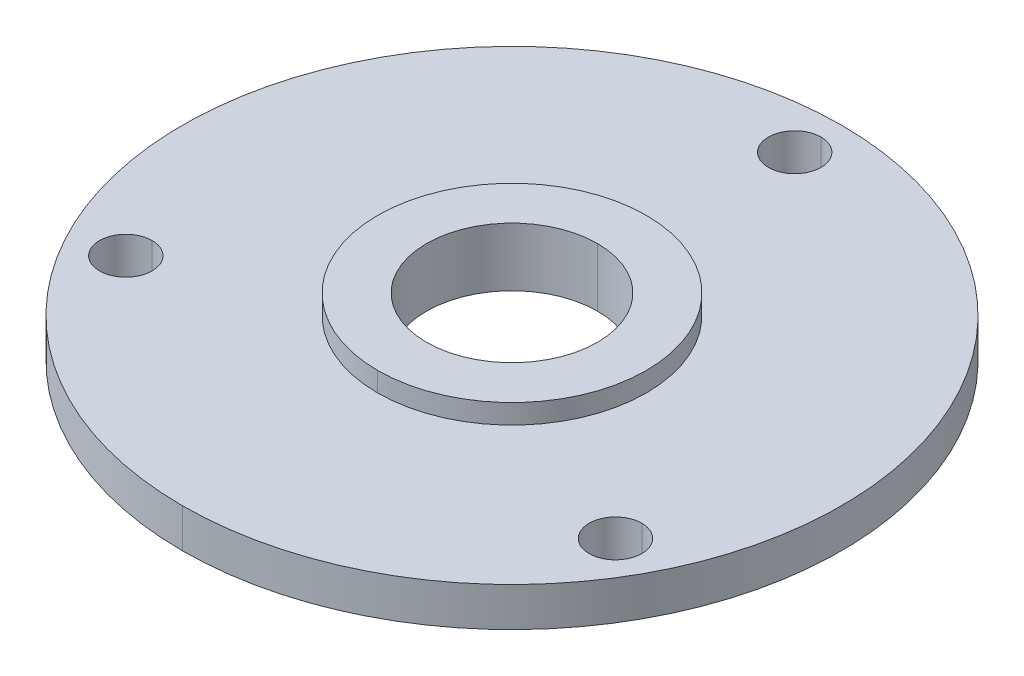
ISO-10303-21;
HEADER;
FILE_DESCRIPTION(('STEP AP214'),'2;1');
FILE_NAME('part.step','',(''),(''),'','','');
FILE_SCHEMA(('AUTOMOTIVE_DESIGN { 1 0 10303 214 1 1 1 1 }'));
ENDSEC;
DATA;
#1=APPLICATION_CONTEXT('core data for automotive mechanical design processes');
#2=APPLICATION_PROTOCOL_DEFINITION('international standard','automotive_design',2000,#1);
#3=PRODUCT_CONTEXT('',#1,'mechanical');
#4=PRODUCT('Part','Part','',(#3));
#5=PRODUCT_RELATED_PRODUCT_CATEGORY('part','',(#4));
#6=PRODUCT_DEFINITION_FORMATION('','',#4);
#7=PRODUCT_DEFINITION_CONTEXT('part definition',#1,'design');
#8=PRODUCT_DEFINITION('design','',#6,#7);
#9=PRODUCT_DEFINITION_SHAPE('','',#8);
#10=(LENGTH_UNIT() NAMED_UNIT(*) SI_UNIT(.MILLI.,.METRE.));
#11=(NAMED_UNIT(*) PLANE_ANGLE_UNIT() SI_UNIT($,.RADIAN.));
#12=(NAMED_UNIT(*) SI_UNIT($,.STERADIAN.) SOLID_ANGLE_UNIT());
#13=UNCERTAINTY_MEASURE_WITH_UNIT(LENGTH_MEASURE(1.E-05),#10,'distance_accuracy_value','');
#14=(GEOMETRIC_REPRESENTATION_CONTEXT(3) GLOBAL_UNCERTAINTY_ASSIGNED_CONTEXT((#13)) GLOBAL_UNIT_ASSIGNED_CONTEXT((#10,
#11,#12)) REPRESENTATION_CONTEXT('',''));
#15=CARTESIAN_POINT('',(0.,0.,0.));
#16=DIRECTION('',(0.,0.,1.));
#17=DIRECTION('',(1.,0.,0.));
#18=AXIS2_PLACEMENT_3D('',#15,#16,#17);
#19=CARTESIAN_POINT('',(1.2715687545039E-12,0.,-18.3893262792378));
#20=DIRECTION('',(0.,1.,0.));
#21=DIRECTION('',(0.,0.,1.));
#22=AXIS2_PLACEMENT_3D('',#19,#20,#21);
#23=CYLINDRICAL_SURFACE('',#22,1.71138923587516);
#24=DIRECTION('',(0.,1.,0.));
#25=VECTOR('',#24,1.);
#26=CARTESIAN_POINT('',(1.27177833923888E-12,0.,-20.100715515113));
#27=LINE('',#26,#25);
#28=CARTESIAN_POINT('',(1.27177833923888E-12,0.,-20.100715515113));
#29=VERTEX_POINT('',#28);
#30=CARTESIAN_POINT('',(1.27177833923888E-12,2.54,-20.100715515113));
#31=VERTEX_POINT('',#30);
#32=EDGE_CURVE('E163',#29,#31,#27,.T.);
#33=ORIENTED_EDGE('',*,*,#32,.F.);
#34=CARTESIAN_POINT('',(1.2715687545039E-12,0.,-18.3893262792378));
#35=DIRECTION('',(0.,1.,0.));
#36=DIRECTION('',(0.,0.,1.));
#37=AXIS2_PLACEMENT_3D('',#34,#35,#36);
#38=CIRCLE('',#37,1.71138923587516);
#39=CARTESIAN_POINT('',(1.2715687545039E-12,0.,-16.6779370433627));
#40=VERTEX_POINT('',#39);
#41=EDGE_CURVE('E198',#40,#29,#38,.T.);
#42=ORIENTED_EDGE('',*,*,#41,.F.);
#43=DIRECTION('',(0.,1.,0.));
#44=VECTOR('',#43,1.);
#45=CARTESIAN_POINT('',(1.2715687545039E-12,0.,-16.6779370433627));
#46=LINE('',#45,#44);
#47=CARTESIAN_POINT('',(1.2715687545039E-12,2.54,-16.6779370433627));
#48=VERTEX_POINT('',#47);
#49=EDGE_CURVE('E166',#40,#48,#46,.T.);
#50=ORIENTED_EDGE('',*,*,#49,.T.);
#51=CARTESIAN_POINT('',(1.2715687545039E-12,2.54,-18.3893262792378));
#52=DIRECTION('',(0.,1.,0.));
#53=DIRECTION('',(0.,0.,1.));
#54=AXIS2_PLACEMENT_3D('',#51,#52,#53);
#55=CIRCLE('',#54,1.71138923587516);
#56=EDGE_CURVE('E155',#48,#31,#55,.T.);
#57=ORIENTED_EDGE('',*,*,#56,.T.);
#58=EDGE_LOOP('',(#33,#42,#50,#57));
#59=FACE_BOUND('',#58,.T.);
#60=ADVANCED_FACE('F16',(#59),#23,.F.);
#61=CARTESIAN_POINT('',(15.9256237163013,0.,9.19466313961934));
#62=DIRECTION('',(0.,1.,0.));
#63=DIRECTION('',(0.,0.,1.));
#64=AXIS2_PLACEMENT_3D('',#61,#62,#63);
#65=CYLINDRICAL_SURFACE('',#64,1.71138923587618);
#66=DIRECTION('',(0.,1.,0.));
#67=VECTOR('',#66,1.);
#68=CARTESIAN_POINT('',(15.9256237163013,0.,7.48327390374317));
#69=LINE('',#68,#67);
#70=CARTESIAN_POINT('',(15.9256237163013,0.,7.48327390374317));
#71=VERTEX_POINT('',#70);
#72=CARTESIAN_POINT('',(15.9256237163013,2.54,7.48327390374317));
#73=VERTEX_POINT('',#72);
#74=EDGE_CURVE('E205',#71,#73,#69,.T.);
#75=ORIENTED_EDGE('',*,*,#74,.F.);
#76=CARTESIAN_POINT('',(15.9256237163013,0.,9.19466313961934));
#77=DIRECTION('',(0.,1.,0.));
#78=DIRECTION('',(0.,0.,1.));
#79=AXIS2_PLACEMENT_3D('',#76,#77,#78);
#80=CIRCLE('',#79,1.71138923587618);
#81=CARTESIAN_POINT('',(15.9256237163013,0.,10.9060523754955));
#82=VERTEX_POINT('',#81);
#83=EDGE_CURVE('E148',#82,#71,#80,.T.);
#84=ORIENTED_EDGE('',*,*,#83,.F.);
#85=DIRECTION('',(0.,1.,0.));
#86=VECTOR('',#85,1.);
#87=CARTESIAN_POINT('',(15.9256237163013,0.,10.9060523754955));
#88=LINE('',#87,#86);
#89=CARTESIAN_POINT('',(15.9256237163013,2.54,10.9060523754955));
#90=VERTEX_POINT('',#89);
#91=EDGE_CURVE('E204',#82,#90,#88,.T.);
#92=ORIENTED_EDGE('',*,*,#91,.T.);
#93=CARTESIAN_POINT('',(15.9256237163013,2.54,9.19466313961934));
#94=DIRECTION('',(0.,1.,0.));
#95=DIRECTION('',(0.,0.,1.));
#96=AXIS2_PLACEMENT_3D('',#93,#94,#95);
#97=CIRCLE('',#96,1.71138923587618);
#98=EDGE_CURVE('E123',#90,#73,#97,.T.);
#99=ORIENTED_EDGE('',*,*,#98,.T.);
#100=EDGE_LOOP('',(#75,#84,#92,#99));
#101=FACE_BOUND('',#100,.T.);
#102=ADVANCED_FACE('F521',(#101),#65,.F.);
#103=CARTESIAN_POINT('',(-15.9256237163002,0.,9.19466313961852));
#104=DIRECTION('',(0.,1.,0.));
#105=DIRECTION('',(0.,0.,1.));
#106=AXIS2_PLACEMENT_3D('',#103,#104,#105);
#107=CYLINDRICAL_SURFACE('',#106,1.71138923587664);
#108=DIRECTION('',(0.,1.,0.));
#109=VECTOR('',#108,1.);
#110=CARTESIAN_POINT('',(-15.9256237163002,0.,7.48327390374187));
#111=LINE('',#110,#109);
#112=CARTESIAN_POINT('',(-15.9256237163002,0.,7.48327390374187));
#113=VERTEX_POINT('',#112);
#114=CARTESIAN_POINT('',(-15.9256237163002,2.54,7.48327390374187));
#115=VERTEX_POINT('',#114);
#116=EDGE_CURVE('E194',#113,#115,#111,.T.);
#117=ORIENTED_EDGE('',*,*,#116,.F.);
#118=CARTESIAN_POINT('',(-15.9256237163002,0.,9.19466313961852));
#119=DIRECTION('',(0.,1.,0.));
#120=DIRECTION('',(0.,0.,1.));
#121=AXIS2_PLACEMENT_3D('',#118,#119,#120);
#122=CIRCLE('',#121,1.71138923587664);
#123=CARTESIAN_POINT('',(-15.9256237163002,0.,10.9060523754952));
#124=VERTEX_POINT('',#123);
#125=EDGE_CURVE('E229',#124,#113,#122,.T.);
#126=ORIENTED_EDGE('',*,*,#125,.F.);
#127=DIRECTION('',(0.,1.,0.));
#128=VECTOR('',#127,1.);
#129=CARTESIAN_POINT('',(-15.9256237163002,0.,10.9060523754952));
#130=LINE('',#129,#128);
#131=CARTESIAN_POINT('',(-15.9256237163002,2.54,10.9060523754952));
#132=VERTEX_POINT('',#131);
#133=EDGE_CURVE('E193',#124,#132,#130,.T.);
#134=ORIENTED_EDGE('',*,*,#133,.T.);
#135=CARTESIAN_POINT('',(-15.9256237163002,2.54,9.19466313961852));
#136=DIRECTION('',(0.,1.,0.));
#137=DIRECTION('',(0.,0.,1.));
#138=AXIS2_PLACEMENT_3D('',#135,#136,#137);
#139=CIRCLE('',#138,1.71138923587664);
#140=EDGE_CURVE('E114',#132,#115,#139,.T.);
#141=ORIENTED_EDGE('',*,*,#140,.T.);
#142=EDGE_LOOP('',(#117,#126,#134,#141));
#143=FACE_BOUND('',#142,.T.);
#144=ADVANCED_FACE('F442',(#143),#107,.F.);
#145=CARTESIAN_POINT('',(0.,0.,0.));
#146=DIRECTION('',(0.,1.,0.));
#147=DIRECTION('',(0.,0.,1.));
#148=AXIS2_PLACEMENT_3D('',#145,#146,#147);
#149=CYLINDRICAL_SURFACE('',#148,5.5626);
#150=DIRECTION('',(0.,1.,0.));
#151=VECTOR('',#150,1.);
#152=CARTESIAN_POINT('',(0.,0.,-5.5626));
#153=LINE('',#152,#151);
#154=CARTESIAN_POINT('',(0.,0.,-5.5626));
#155=VERTEX_POINT('',#154);
#156=CARTESIAN_POINT('',(0.,3.81,-5.5626));
#157=VERTEX_POINT('',#156);
#158=EDGE_CURVE('E238',#155,#157,#153,.T.);
#159=ORIENTED_EDGE('',*,*,#158,.F.);
#160=CARTESIAN_POINT('',(0.,0.,0.));
#161=DIRECTION('',(0.,1.,0.));
#162=DIRECTION('',(0.,0.,1.));
#163=AXIS2_PLACEMENT_3D('',#160,#161,#162);
#164=CIRCLE('',#163,5.5626);
#165=CARTESIAN_POINT('',(0.,0.,5.5626));
#166=VERTEX_POINT('',#165);
#167=EDGE_CURVE('E102',#166,#155,#164,.T.);
#168=ORIENTED_EDGE('',*,*,#167,.F.);
#169=DIRECTION('',(0.,1.,0.));
#170=VECTOR('',#169,1.);
#171=CARTESIAN_POINT('',(0.,0.,5.5626));
#172=LINE('',#171,#170);
#173=CARTESIAN_POINT('',(0.,3.81,5.5626));
#174=VERTEX_POINT('',#173);
#175=EDGE_CURVE('E232',#166,#174,#172,.T.);
#176=ORIENTED_EDGE('',*,*,#175,.T.);
#177=CARTESIAN_POINT('',(0.,3.81,0.));
#178=DIRECTION('',(0.,1.,0.));
#179=DIRECTION('',(0.,0.,1.));
#180=AXIS2_PLACEMENT_3D('',#177,#178,#179);
#181=CIRCLE('',#180,5.5626);
#182=EDGE_CURVE('E11',#174,#157,#181,.T.);
#183=ORIENTED_EDGE('',*,*,#182,.T.);
#184=EDGE_LOOP('',(#159,#168,#176,#183));
#185=FACE_BOUND('',#184,.T.);
#186=ADVANCED_FACE('F437',(#185),#149,.F.);
#187=CARTESIAN_POINT('',(0.,3.81,0.));
#188=DIRECTION('',(0.,1.,0.));
#189=DIRECTION('',(1.,0.,0.));
#190=AXIS2_PLACEMENT_3D('',#187,#188,#189);
#191=PLANE('',#190);
#192=ORIENTED_EDGE('',*,*,#182,.F.);
#193=CARTESIAN_POINT('',(0.,3.81,0.));
#194=DIRECTION('',(0.,1.,0.));
#195=DIRECTION('',(0.,0.,1.));
#196=AXIS2_PLACEMENT_3D('',#193,#194,#195);
#197=CIRCLE('',#196,5.5626);
#198=EDGE_CURVE('E237',#157,#174,#197,.T.);
#199=ORIENTED_EDGE('',*,*,#198,.F.);
#200=EDGE_LOOP('',(#192,#199));
#201=FACE_BOUND('',#200,.T.);
#202=CARTESIAN_POINT('',(0.,3.81,0.));
#203=DIRECTION('',(0.,1.,0.));
#204=DIRECTION('',(0.,0.,1.));
#205=AXIS2_PLACEMENT_3D('',#202,#203,#204);
#206=CIRCLE('',#205,8.7376);
#207=CARTESIAN_POINT('',(0.,3.81,-8.7376));
#208=VERTEX_POINT('',#207);
#209=CARTESIAN_POINT('',(0.,3.81,8.7376));
#210=VERTEX_POINT('',#209);
#211=EDGE_CURVE('E27',#208,#210,#206,.T.);
#212=ORIENTED_EDGE('',*,*,#211,.T.);
#213=CARTESIAN_POINT('',(0.,3.81,0.));
#214=DIRECTION('',(0.,1.,0.));
#215=DIRECTION('',(0.,0.,1.));
#216=AXIS2_PLACEMENT_3D('',#213,#214,#215);
#217=CIRCLE('',#216,8.7376);
#218=EDGE_CURVE('E236',#210,#208,#217,.T.);
#219=ORIENTED_EDGE('',*,*,#218,.T.);
#220=EDGE_LOOP('',(#212,#219));
#221=FACE_BOUND('',#220,.T.);
#222=ADVANCED_FACE('F441',(#201,#221),#191,.T.);
#223=CARTESIAN_POINT('',(0.,3.81,0.));
#224=DIRECTION('',(0.,-1.,0.));
#225=DIRECTION('',(0.,0.,-1.));
#226=AXIS2_PLACEMENT_3D('',#223,#224,#225);
#227=CYLINDRICAL_SURFACE('',#226,8.7376);
#228=DIRECTION('',(0.,-1.,0.));
#229=VECTOR('',#228,1.);
#230=CARTESIAN_POINT('',(0.,3.81,8.7376));
#231=LINE('',#230,#229);
#232=CARTESIAN_POINT('',(0.,2.54,8.7376));
#233=VERTEX_POINT('',#232);
#234=EDGE_CURVE('E218',#210,#233,#231,.T.);
#235=ORIENTED_EDGE('',*,*,#234,.F.);
#236=ORIENTED_EDGE('',*,*,#211,.F.);
#237=DIRECTION('',(0.,-1.,0.));
#238=VECTOR('',#237,1.);
#239=CARTESIAN_POINT('',(0.,3.81,-8.7376));
#240=LINE('',#239,#238);
#241=CARTESIAN_POINT('',(0.,2.54,-8.7376));
#242=VERTEX_POINT('',#241);
#243=EDGE_CURVE('E217',#208,#242,#240,.T.);
#244=ORIENTED_EDGE('',*,*,#243,.T.);
#245=CARTESIAN_POINT('',(0.,2.54,0.));
#246=DIRECTION('',(0.,1.,0.));
#247=DIRECTION('',(0.,0.,1.));
#248=AXIS2_PLACEMENT_3D('',#245,#246,#247);
#249=CIRCLE('',#248,8.7376);
#250=EDGE_CURVE('E195',#242,#233,#249,.T.);
#251=ORIENTED_EDGE('',*,*,#250,.T.);
#252=EDGE_LOOP('',(#235,#236,#244,#251));
#253=FACE_BOUND('',#252,.T.);
#254=ADVANCED_FACE('F460',(#253),#227,.T.);
#255=CARTESIAN_POINT('',(0.,0.,0.));
#256=DIRECTION('',(0.,1.,0.));
#257=DIRECTION('',(1.,0.,0.));
#258=AXIS2_PLACEMENT_3D('',#255,#256,#257);
#259=PLANE('',#258);
#260=ORIENTED_EDGE('',*,*,#167,.T.);
#261=CARTESIAN_POINT('',(0.,0.,0.));
#262=DIRECTION('',(0.,1.,0.));
#263=DIRECTION('',(0.,0.,1.));
#264=AXIS2_PLACEMENT_3D('',#261,#262,#263);
#265=CIRCLE('',#264,5.5626);
#266=EDGE_CURVE('E221',#155,#166,#265,.T.);
#267=ORIENTED_EDGE('',*,*,#266,.T.);
#268=EDGE_LOOP('',(#260,#267));
#269=FACE_BOUND('',#268,.T.);
#270=ORIENTED_EDGE('',*,*,#125,.T.);
#271=CARTESIAN_POINT('',(-15.9256237163002,0.,9.19466313961852));
#272=DIRECTION('',(0.,1.,0.));
#273=DIRECTION('',(0.,0.,1.));
#274=AXIS2_PLACEMENT_3D('',#271,#272,#273);
#275=CIRCLE('',#274,1.71138923587664);
#276=EDGE_CURVE('E212',#113,#124,#275,.T.);
#277=ORIENTED_EDGE('',*,*,#276,.T.);
#278=EDGE_LOOP('',(#270,#277));
#279=FACE_BOUND('',#278,.T.);
#280=ORIENTED_EDGE('',*,*,#83,.T.);
#281=CARTESIAN_POINT('',(15.9256237163013,0.,9.19466313961934));
#282=DIRECTION('',(0.,1.,0.));
#283=DIRECTION('',(0.,0.,1.));
#284=AXIS2_PLACEMENT_3D('',#281,#282,#283);
#285=CIRCLE('',#284,1.71138923587618);
#286=EDGE_CURVE('E252',#71,#82,#285,.T.);
#287=ORIENTED_EDGE('',*,*,#286,.T.);
#288=EDGE_LOOP('',(#280,#287));
#289=FACE_BOUND('',#288,.T.);
#290=ORIENTED_EDGE('',*,*,#41,.T.);
#291=CARTESIAN_POINT('',(1.2715687545039E-12,0.,-18.3893262792378));
#292=DIRECTION('',(0.,1.,0.));
#293=DIRECTION('',(0.,0.,1.));
#294=AXIS2_PLACEMENT_3D('',#291,#292,#293);
#295=CIRCLE('',#294,1.71138923587516);
#296=EDGE_CURVE('E178',#29,#40,#295,.T.);
#297=ORIENTED_EDGE('',*,*,#296,.T.);
#298=EDGE_LOOP('',(#290,#297));
#299=FACE_BOUND('',#298,.T.);
#300=CARTESIAN_POINT('',(0.,0.,0.));
#301=DIRECTION('',(0.,1.,0.));
#302=DIRECTION('',(0.,0.,1.));
#303=AXIS2_PLACEMENT_3D('',#300,#301,#302);
#304=CIRCLE('',#303,21.4376);
#305=CARTESIAN_POINT('',(0.,0.,-21.4376));
#306=VERTEX_POINT('',#305);
#307=CARTESIAN_POINT('',(0.,0.,21.4376));
#308=VERTEX_POINT('',#307);
#309=EDGE_CURVE('E41',#306,#308,#304,.T.);
#310=ORIENTED_EDGE('',*,*,#309,.F.);
#311=CARTESIAN_POINT('',(0.,0.,0.));
#312=DIRECTION('',(0.,1.,0.));
#313=DIRECTION('',(0.,0.,1.));
#314=AXIS2_PLACEMENT_3D('',#311,#312,#313);
#315=CIRCLE('',#314,21.4376);
#316=EDGE_CURVE('E20',#308,#306,#315,.T.);
#317=ORIENTED_EDGE('',*,*,#316,.F.);
#318=EDGE_LOOP('',(#310,#317));
#319=FACE_BOUND('',#318,.T.);
#320=ADVANCED_FACE('F483',(#269,#279,#289,#299,#319),#259,.F.);
#321=CARTESIAN_POINT('',(0.,2.54,0.));
#322=DIRECTION('',(0.,1.,0.));
#323=DIRECTION('',(1.,0.,0.));
#324=AXIS2_PLACEMENT_3D('',#321,#322,#323);
#325=PLANE('',#324);
#326=ORIENTED_EDGE('',*,*,#250,.F.);
#327=CARTESIAN_POINT('',(0.,2.54,0.));
#328=DIRECTION('',(0.,1.,0.));
#329=DIRECTION('',(0.,0.,1.));
#330=AXIS2_PLACEMENT_3D('',#327,#328,#329);
#331=CIRCLE('',#330,8.7376);
#332=EDGE_CURVE('E213',#233,#242,#331,.T.);
#333=ORIENTED_EDGE('',*,*,#332,.F.);
#334=EDGE_LOOP('',(#326,#333));
#335=FACE_BOUND('',#334,.T.);
#336=ORIENTED_EDGE('',*,*,#140,.F.);
#337=CARTESIAN_POINT('',(-15.9256237163002,2.54,9.19466313961852));
#338=DIRECTION('',(0.,1.,0.));
#339=DIRECTION('',(0.,0.,1.));
#340=AXIS2_PLACEMENT_3D('',#337,#338,#339);
#341=CIRCLE('',#340,1.71138923587664);
#342=EDGE_CURVE('E189',#115,#132,#341,.T.);
#343=ORIENTED_EDGE('',*,*,#342,.F.);
#344=EDGE_LOOP('',(#336,#343));
#345=FACE_BOUND('',#344,.T.);
#346=ORIENTED_EDGE('',*,*,#98,.F.);
#347=CARTESIAN_POINT('',(15.9256237163013,2.54,9.19466313961934));
#348=DIRECTION('',(0.,1.,0.));
#349=DIRECTION('',(0.,0.,1.));
#350=AXIS2_PLACEMENT_3D('',#347,#348,#349);
#351=CIRCLE('',#350,1.71138923587618);
#352=EDGE_CURVE('E201',#73,#90,#351,.T.);
#353=ORIENTED_EDGE('',*,*,#352,.F.);
#354=EDGE_LOOP('',(#346,#353));
#355=FACE_BOUND('',#354,.T.);
#356=ORIENTED_EDGE('',*,*,#56,.F.);
#357=CARTESIAN_POINT('',(1.2715687545039E-12,2.54,-18.3893262792378));
#358=DIRECTION('',(0.,1.,0.));
#359=DIRECTION('',(0.,0.,1.));
#360=AXIS2_PLACEMENT_3D('',#357,#358,#359);
#361=CIRCLE('',#360,1.71138923587516);
#362=EDGE_CURVE('E170',#31,#48,#361,.T.);
#363=ORIENTED_EDGE('',*,*,#362,.F.);
#364=EDGE_LOOP('',(#356,#363));
#365=FACE_BOUND('',#364,.T.);
#366=CARTESIAN_POINT('',(0.,2.54,0.));
#367=DIRECTION('',(0.,1.,0.));
#368=DIRECTION('',(0.,0.,1.));
#369=AXIS2_PLACEMENT_3D('',#366,#367,#368);
#370=CIRCLE('',#369,21.4376);
#371=CARTESIAN_POINT('',(0.,2.54,-21.4376));
#372=VERTEX_POINT('',#371);
#373=CARTESIAN_POINT('',(0.,2.54,21.4376));
#374=VERTEX_POINT('',#373);
#375=EDGE_CURVE('E248',#372,#374,#370,.T.);
#376=ORIENTED_EDGE('',*,*,#375,.T.);
#377=CARTESIAN_POINT('',(0.,2.54,0.));
#378=DIRECTION('',(0.,1.,0.));
#379=DIRECTION('',(0.,0.,1.));
#380=AXIS2_PLACEMENT_3D('',#377,#378,#379);
#381=CIRCLE('',#380,21.4376);
#382=EDGE_CURVE('E225',#374,#372,#381,.T.);
#383=ORIENTED_EDGE('',*,*,#382,.T.);
#384=EDGE_LOOP('',(#376,#383));
#385=FACE_BOUND('',#384,.T.);
#386=ADVANCED_FACE('F171',(#335,#345,#355,#365,#385),#325,.T.);
#387=CARTESIAN_POINT('',(0.,2.54,0.));
#388=DIRECTION('',(0.,-1.,0.));
#389=DIRECTION('',(0.,0.,-1.));
#390=AXIS2_PLACEMENT_3D('',#387,#388,#389);
#391=CYLINDRICAL_SURFACE('',#390,21.4376);
#392=DIRECTION('',(0.,-1.,0.));
#393=VECTOR('',#392,1.);
#394=CARTESIAN_POINT('',(0.,2.54,21.4376));
#395=LINE('',#394,#393);
#396=EDGE_CURVE('E242',#374,#308,#395,.T.);
#397=ORIENTED_EDGE('',*,*,#396,.F.);
#398=ORIENTED_EDGE('',*,*,#375,.F.);
#399=DIRECTION('',(0.,-1.,0.));
#400=VECTOR('',#399,1.);
#401=CARTESIAN_POINT('',(0.,2.54,-21.4376));
#402=LINE('',#401,#400);
#403=EDGE_CURVE('E275',#372,#306,#402,.T.);
#404=ORIENTED_EDGE('',*,*,#403,.T.);
#405=ORIENTED_EDGE('',*,*,#309,.T.);
#406=EDGE_LOOP('',(#397,#398,#404,#405));
#407=FACE_BOUND('',#406,.T.);
#408=ADVANCED_FACE('F474',(#407),#391,.T.);
#409=CARTESIAN_POINT('',(0.,2.54,0.));
#410=DIRECTION('',(0.,-1.,0.));
#411=DIRECTION('',(0.,0.,-1.));
#412=AXIS2_PLACEMENT_3D('',#409,#410,#411);
#413=CYLINDRICAL_SURFACE('',#412,21.4376);
#414=ORIENTED_EDGE('',*,*,#382,.F.);
#415=ORIENTED_EDGE('',*,*,#396,.T.);
#416=ORIENTED_EDGE('',*,*,#316,.T.);
#417=ORIENTED_EDGE('',*,*,#403,.F.);
#418=EDGE_LOOP('',(#414,#415,#416,#417));
#419=FACE_BOUND('',#418,.T.);
#420=ADVANCED_FACE('F470',(#419),#413,.T.);
#421=CARTESIAN_POINT('',(0.,3.81,0.));
#422=DIRECTION('',(0.,-1.,0.));
#423=DIRECTION('',(0.,0.,-1.));
#424=AXIS2_PLACEMENT_3D('',#421,#422,#423);
#425=CYLINDRICAL_SURFACE('',#424,8.7376);
#426=ORIENTED_EDGE('',*,*,#218,.F.);
#427=ORIENTED_EDGE('',*,*,#234,.T.);
#428=ORIENTED_EDGE('',*,*,#332,.T.);
#429=ORIENTED_EDGE('',*,*,#243,.F.);
#430=EDGE_LOOP('',(#426,#427,#428,#429));
#431=FACE_BOUND('',#430,.T.);
#432=ADVANCED_FACE('F18',(#431),#425,.T.);
#433=CARTESIAN_POINT('',(0.,0.,0.));
#434=DIRECTION('',(0.,1.,0.));
#435=DIRECTION('',(0.,0.,1.));
#436=AXIS2_PLACEMENT_3D('',#433,#434,#435);
#437=CYLINDRICAL_SURFACE('',#436,5.5626);
#438=ORIENTED_EDGE('',*,*,#266,.F.);
#439=ORIENTED_EDGE('',*,*,#158,.T.);
#440=ORIENTED_EDGE('',*,*,#198,.T.);
#441=ORIENTED_EDGE('',*,*,#175,.F.);
#442=EDGE_LOOP('',(#438,#439,#440,#441));
#443=FACE_BOUND('',#442,.T.);
#444=ADVANCED_FACE('F509',(#443),#437,.F.);
#445=CARTESIAN_POINT('',(-15.9256237163002,0.,9.19466313961852));
#446=DIRECTION('',(0.,1.,0.));
#447=DIRECTION('',(0.,0.,1.));
#448=AXIS2_PLACEMENT_3D('',#445,#446,#447);
#449=CYLINDRICAL_SURFACE('',#448,1.71138923587664);
#450=ORIENTED_EDGE('',*,*,#276,.F.);
#451=ORIENTED_EDGE('',*,*,#116,.T.);
#452=ORIENTED_EDGE('',*,*,#342,.T.);
#453=ORIENTED_EDGE('',*,*,#133,.F.);
#454=EDGE_LOOP('',(#450,#451,#452,#453));
#455=FACE_BOUND('',#454,.T.);
#456=ADVANCED_FACE('F503',(#455),#449,.F.);
#457=CARTESIAN_POINT('',(15.9256237163013,0.,9.19466313961934));
#458=DIRECTION('',(0.,1.,0.));
#459=DIRECTION('',(0.,0.,1.));
#460=AXIS2_PLACEMENT_3D('',#457,#458,#459);
#461=CYLINDRICAL_SURFACE('',#460,1.71138923587618);
#462=ORIENTED_EDGE('',*,*,#286,.F.);
#463=ORIENTED_EDGE('',*,*,#74,.T.);
#464=ORIENTED_EDGE('',*,*,#352,.T.);
#465=ORIENTED_EDGE('',*,*,#91,.F.);
#466=EDGE_LOOP('',(#462,#463,#464,#465));
#467=FACE_BOUND('',#466,.T.);
#468=ADVANCED_FACE('F451',(#467),#461,.F.);
#469=CARTESIAN_POINT('',(1.2715687545039E-12,0.,-18.3893262792378));
#470=DIRECTION('',(0.,1.,0.));
#471=DIRECTION('',(0.,0.,1.));
#472=AXIS2_PLACEMENT_3D('',#469,#470,#471);
#473=CYLINDRICAL_SURFACE('',#472,1.71138923587516);
#474=ORIENTED_EDGE('',*,*,#296,.F.);
#475=ORIENTED_EDGE('',*,*,#32,.T.);
#476=ORIENTED_EDGE('',*,*,#362,.T.);
#477=ORIENTED_EDGE('',*,*,#49,.F.);
#478=EDGE_LOOP('',(#474,#475,#476,#477));
#479=FACE_BOUND('',#478,.T.);
#480=ADVANCED_FACE('F176',(#479),#473,.F.);
#481=CLOSED_SHELL('',(#60,#102,#144,#186,#222,#254,#320,#386,#408,#420,#432,#444,#456,#468,#480));
#482=MANIFOLD_SOLID_BREP('B1',#481);
#483=ADVANCED_BREP_SHAPE_REPRESENTATION('',(#18,#482),#14);
#484=SHAPE_DEFINITION_REPRESENTATION(#9,#483);
ENDSEC;
END-ISO-10303-21;
